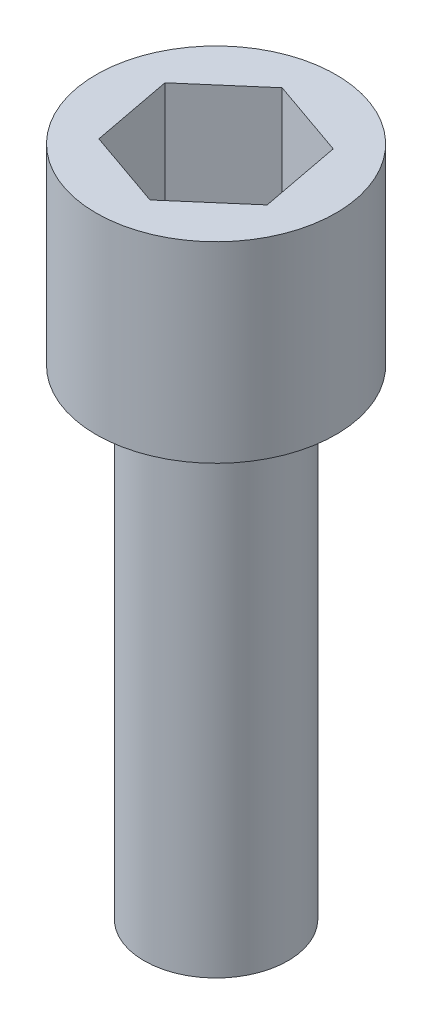
ISO-10303-21;
HEADER;
FILE_DESCRIPTION(('STEP AP214'),'2;1');
FILE_NAME('part.step','',(''),(''),'','','');
FILE_SCHEMA(('AUTOMOTIVE_DESIGN { 1 0 10303 214 1 1 1 1 }'));
ENDSEC;
DATA;
#1=APPLICATION_CONTEXT('core data for automotive mechanical design processes');
#2=APPLICATION_PROTOCOL_DEFINITION('international standard','automotive_design',2000,#1);
#3=PRODUCT_CONTEXT('',#1,'mechanical');
#4=PRODUCT('Part','Part','',(#3));
#5=PRODUCT_RELATED_PRODUCT_CATEGORY('part','',(#4));
#6=PRODUCT_DEFINITION_FORMATION('','',#4);
#7=PRODUCT_DEFINITION_CONTEXT('part definition',#1,'design');
#8=PRODUCT_DEFINITION('design','',#6,#7);
#9=PRODUCT_DEFINITION_SHAPE('','',#8);
#10=(LENGTH_UNIT() NAMED_UNIT(*) SI_UNIT(.MILLI.,.METRE.));
#11=(NAMED_UNIT(*) PLANE_ANGLE_UNIT() SI_UNIT($,.RADIAN.));
#12=(NAMED_UNIT(*) SI_UNIT($,.STERADIAN.) SOLID_ANGLE_UNIT());
#13=UNCERTAINTY_MEASURE_WITH_UNIT(LENGTH_MEASURE(1.E-05),#10,'distance_accuracy_value','');
#14=(GEOMETRIC_REPRESENTATION_CONTEXT(3) GLOBAL_UNCERTAINTY_ASSIGNED_CONTEXT((#13)) GLOBAL_UNIT_ASSIGNED_CONTEXT((#10,
#11,#12)) REPRESENTATION_CONTEXT('',''));
#15=CARTESIAN_POINT('',(0.,0.,0.));
#16=DIRECTION('',(0.,0.,1.));
#17=DIRECTION('',(1.,0.,0.));
#18=AXIS2_PLACEMENT_3D('',#15,#16,#17);
#19=CARTESIAN_POINT('',(0.,20.,0.));
#20=DIRECTION('',(0.,-1.,0.));
#21=DIRECTION('',(0.,0.,-1.));
#22=AXIS2_PLACEMENT_3D('',#19,#20,#21);
#23=CYLINDRICAL_SURFACE('',#22,3.);
#24=CARTESIAN_POINT('',(0.,20.,0.));
#25=DIRECTION('',(0.,1.,0.));
#26=DIRECTION('',(0.,0.,1.));
#27=AXIS2_PLACEMENT_3D('',#24,#25,#26);
#28=CIRCLE('',#27,3.);
#29=CARTESIAN_POINT('',(0.,20.,3.));
#30=VERTEX_POINT('',#29);
#31=EDGE_CURVE('E11',#30,#30,#28,.T.);
#32=ORIENTED_EDGE('',*,*,#31,.F.);
#33=EDGE_LOOP('',(#32));
#34=FACE_BOUND('',#33,.T.);
#35=CARTESIAN_POINT('',(0.,0.,0.));
#36=DIRECTION('',(0.,1.,0.));
#37=DIRECTION('',(0.,0.,1.));
#38=AXIS2_PLACEMENT_3D('',#35,#36,#37);
#39=CIRCLE('',#38,3.);
#40=CARTESIAN_POINT('',(0.,0.,3.));
#41=VERTEX_POINT('',#40);
#42=EDGE_CURVE('E36',#41,#41,#39,.T.);
#43=ORIENTED_EDGE('',*,*,#42,.T.);
#44=EDGE_LOOP('',(#43));
#45=FACE_BOUND('',#44,.T.);
#46=ADVANCED_FACE('F33',(#34,#45),#23,.T.);
#47=CARTESIAN_POINT('',(0.,0.,0.));
#48=DIRECTION('',(0.,1.,0.));
#49=DIRECTION('',(0.,0.,1.));
#50=AXIS2_PLACEMENT_3D('',#47,#48,#49);
#51=PLANE('',#50);
#52=ORIENTED_EDGE('',*,*,#42,.F.);
#53=EDGE_LOOP('',(#52));
#54=FACE_BOUND('',#53,.T.);
#55=ADVANCED_FACE('F151',(#54),#51,.F.);
#56=CARTESIAN_POINT('',(0.,20.,0.));
#57=DIRECTION('',(0.,1.,0.));
#58=DIRECTION('',(0.,0.,1.));
#59=AXIS2_PLACEMENT_3D('',#56,#57,#58);
#60=PLANE('',#59);
#61=CARTESIAN_POINT('',(0.,20.,0.));
#62=DIRECTION('',(0.,1.,0.));
#63=DIRECTION('',(0.,0.,1.));
#64=AXIS2_PLACEMENT_3D('',#61,#62,#63);
#65=CIRCLE('',#64,5.);
#66=CARTESIAN_POINT('',(0.,20.,5.));
#67=VERTEX_POINT('',#66);
#68=EDGE_CURVE('E134',#67,#67,#65,.T.);
#69=ORIENTED_EDGE('',*,*,#68,.F.);
#70=EDGE_LOOP('',(#69));
#71=FACE_BOUND('',#70,.T.);
#72=ORIENTED_EDGE('',*,*,#31,.T.);
#73=EDGE_LOOP('',(#72));
#74=FACE_BOUND('',#73,.T.);
#75=ADVANCED_FACE('F148',(#71,#74),#60,.F.);
#76=CARTESIAN_POINT('',(0.,28.,0.));
#77=DIRECTION('',(0.,-1.,0.));
#78=DIRECTION('',(0.,0.,-1.));
#79=AXIS2_PLACEMENT_3D('',#76,#77,#78);
#80=CYLINDRICAL_SURFACE('',#79,5.);
#81=CARTESIAN_POINT('',(0.,28.,0.));
#82=DIRECTION('',(0.,1.,0.));
#83=DIRECTION('',(0.,0.,1.));
#84=AXIS2_PLACEMENT_3D('',#81,#82,#83);
#85=CIRCLE('',#84,5.);
#86=CARTESIAN_POINT('',(0.,28.,5.));
#87=VERTEX_POINT('',#86);
#88=EDGE_CURVE('E140',#87,#87,#85,.T.);
#89=ORIENTED_EDGE('',*,*,#88,.F.);
#90=EDGE_LOOP('',(#89));
#91=FACE_BOUND('',#90,.T.);
#92=ORIENTED_EDGE('',*,*,#68,.T.);
#93=EDGE_LOOP('',(#92));
#94=FACE_BOUND('',#93,.T.);
#95=ADVANCED_FACE('F146',(#91,#94),#80,.T.);
#96=CARTESIAN_POINT('',(0.,28.,0.));
#97=DIRECTION('',(0.,1.,0.));
#98=DIRECTION('',(0.,0.,1.));
#99=AXIS2_PLACEMENT_3D('',#96,#97,#98);
#100=PLANE('',#99);
#101=DIRECTION('',(0.944266096339941,0.,0.329183139457246));
#102=VECTOR('',#101,1.);
#103=CARTESIAN_POINT('',(-2.62306627309725,28.,2.26263636648484));
#104=LINE('',#103,#102);
#105=CARTESIAN_POINT('',(-2.62306627309725,28.,2.26263636648484));
#106=VERTEX_POINT('',#105);
#107=CARTESIAN_POINT('',(0.647967436353767,28.,3.40296021155481));
#108=VERTEX_POINT('',#107);
#109=EDGE_CURVE('E47',#106,#108,#104,.T.);
#110=ORIENTED_EDGE('',*,*,#109,.F.);
#111=DIRECTION('',(0.18705208690248,0.,0.982349997091376));
#112=VECTOR('',#111,1.);
#113=CARTESIAN_POINT('',(-3.27103370945101,28.,-1.14032384506996));
#114=LINE('',#113,#112);
#115=CARTESIAN_POINT('',(-3.27103370945101,28.,-1.14032384506996));
#116=VERTEX_POINT('',#115);
#117=EDGE_CURVE('E130',#116,#106,#114,.T.);
#118=ORIENTED_EDGE('',*,*,#117,.F.);
#119=DIRECTION('',(-0.757214009437461,0.,0.65316685763413));
#120=VECTOR('',#119,1.);
#121=CARTESIAN_POINT('',(-0.647967436353768,28.,-3.40296021155481));
#122=LINE('',#121,#120);
#123=CARTESIAN_POINT('',(-0.647967436353768,28.,-3.40296021155481));
#124=VERTEX_POINT('',#123);
#125=EDGE_CURVE('E128',#124,#116,#122,.T.);
#126=ORIENTED_EDGE('',*,*,#125,.F.);
#127=DIRECTION('',(-0.944266096339941,0.,-0.329183139457246));
#128=VECTOR('',#127,1.);
#129=CARTESIAN_POINT('',(2.62306627309724,28.,-2.26263636648484));
#130=LINE('',#129,#128);
#131=CARTESIAN_POINT('',(2.62306627309724,28.,-2.26263636648484));
#132=VERTEX_POINT('',#131);
#133=EDGE_CURVE('E95',#132,#124,#130,.T.);
#134=ORIENTED_EDGE('',*,*,#133,.F.);
#135=DIRECTION('',(-0.18705208690248,0.,-0.982349997091376));
#136=VECTOR('',#135,1.);
#137=CARTESIAN_POINT('',(3.27103370945101,28.,1.14032384506996));
#138=LINE('',#137,#136);
#139=CARTESIAN_POINT('',(3.27103370945101,28.,1.14032384506996));
#140=VERTEX_POINT('',#139);
#141=EDGE_CURVE('E124',#140,#132,#138,.T.);
#142=ORIENTED_EDGE('',*,*,#141,.F.);
#143=DIRECTION('',(0.757214009437461,0.,-0.65316685763413));
#144=VECTOR('',#143,1.);
#145=CARTESIAN_POINT('',(0.647967436353767,28.,3.40296021155481));
#146=LINE('',#145,#144);
#147=EDGE_CURVE('E121',#108,#140,#146,.T.);
#148=ORIENTED_EDGE('',*,*,#147,.F.);
#149=EDGE_LOOP('',(#110,#118,#126,#134,#142,#148));
#150=FACE_BOUND('',#149,.T.);
#151=ORIENTED_EDGE('',*,*,#88,.T.);
#152=EDGE_LOOP('',(#151));
#153=FACE_BOUND('',#152,.T.);
#154=ADVANCED_FACE('F165',(#150,#153),#100,.T.);
#155=CARTESIAN_POINT('',(-2.62306627309725,23.,2.26263636648484));
#156=DIRECTION('',(-0.329183139457246,0.,0.944266096339941));
#157=DIRECTION('',(0.944266096339941,0.,0.329183139457246));
#158=AXIS2_PLACEMENT_3D('',#155,#156,#157);
#159=PLANE('',#158);
#160=ORIENTED_EDGE('',*,*,#109,.T.);
#161=DIRECTION('',(0.,1.,0.));
#162=VECTOR('',#161,1.);
#163=CARTESIAN_POINT('',(0.647967436353767,23.,3.40296021155481));
#164=LINE('',#163,#162);
#165=CARTESIAN_POINT('',(0.647967436353767,23.,3.40296021155481));
#166=VERTEX_POINT('',#165);
#167=EDGE_CURVE('E77',#166,#108,#164,.T.);
#168=ORIENTED_EDGE('',*,*,#167,.F.);
#169=DIRECTION('',(0.944266096339941,0.,0.329183139457246));
#170=VECTOR('',#169,1.);
#171=CARTESIAN_POINT('',(-2.62306627309725,23.,2.26263636648484));
#172=LINE('',#171,#170);
#173=CARTESIAN_POINT('',(-2.62306627309725,23.,2.26263636648484));
#174=VERTEX_POINT('',#173);
#175=EDGE_CURVE('E132',#174,#166,#172,.T.);
#176=ORIENTED_EDGE('',*,*,#175,.F.);
#177=DIRECTION('',(0.,1.,0.));
#178=VECTOR('',#177,1.);
#179=CARTESIAN_POINT('',(-2.62306627309725,23.,2.26263636648484));
#180=LINE('',#179,#178);
#181=EDGE_CURVE('E55',#174,#106,#180,.T.);
#182=ORIENTED_EDGE('',*,*,#181,.T.);
#183=EDGE_LOOP('',(#160,#168,#176,#182));
#184=FACE_BOUND('',#183,.T.);
#185=ADVANCED_FACE('F170',(#184),#159,.F.);
#186=CARTESIAN_POINT('',(-3.27103370945101,23.,-1.14032384506996));
#187=DIRECTION('',(-0.982349997091376,0.,0.18705208690248));
#188=DIRECTION('',(0.18705208690248,0.,0.982349997091377));
#189=AXIS2_PLACEMENT_3D('',#186,#187,#188);
#190=PLANE('',#189);
#191=ORIENTED_EDGE('',*,*,#117,.T.);
#192=ORIENTED_EDGE('',*,*,#181,.F.);
#193=DIRECTION('',(0.18705208690248,0.,0.982349997091376));
#194=VECTOR('',#193,1.);
#195=CARTESIAN_POINT('',(-3.27103370945101,23.,-1.14032384506996));
#196=LINE('',#195,#194);
#197=CARTESIAN_POINT('',(-3.27103370945101,23.,-1.14032384506996));
#198=VERTEX_POINT('',#197);
#199=EDGE_CURVE('E107',#198,#174,#196,.T.);
#200=ORIENTED_EDGE('',*,*,#199,.F.);
#201=DIRECTION('',(0.,1.,0.));
#202=VECTOR('',#201,1.);
#203=CARTESIAN_POINT('',(-3.27103370945101,23.,-1.14032384506996));
#204=LINE('',#203,#202);
#205=EDGE_CURVE('E99',#198,#116,#204,.T.);
#206=ORIENTED_EDGE('',*,*,#205,.T.);
#207=EDGE_LOOP('',(#191,#192,#200,#206));
#208=FACE_BOUND('',#207,.T.);
#209=ADVANCED_FACE('F174',(#208),#190,.F.);
#210=CARTESIAN_POINT('',(-0.647967436353768,23.,-3.40296021155481));
#211=DIRECTION('',(-0.65316685763413,0.,-0.757214009437461));
#212=DIRECTION('',(-0.757214009437462,0.,0.65316685763413));
#213=AXIS2_PLACEMENT_3D('',#210,#211,#212);
#214=PLANE('',#213);
#215=ORIENTED_EDGE('',*,*,#125,.T.);
#216=ORIENTED_EDGE('',*,*,#205,.F.);
#217=DIRECTION('',(-0.757214009437461,0.,0.65316685763413));
#218=VECTOR('',#217,1.);
#219=CARTESIAN_POINT('',(-0.647967436353768,23.,-3.40296021155481));
#220=LINE('',#219,#218);
#221=CARTESIAN_POINT('',(-0.647967436353768,23.,-3.40296021155481));
#222=VERTEX_POINT('',#221);
#223=EDGE_CURVE('E103',#222,#198,#220,.T.);
#224=ORIENTED_EDGE('',*,*,#223,.F.);
#225=DIRECTION('',(0.,1.,0.));
#226=VECTOR('',#225,1.);
#227=CARTESIAN_POINT('',(-0.647967436353768,23.,-3.40296021155481));
#228=LINE('',#227,#226);
#229=EDGE_CURVE('E88',#222,#124,#228,.T.);
#230=ORIENTED_EDGE('',*,*,#229,.T.);
#231=EDGE_LOOP('',(#215,#216,#224,#230));
#232=FACE_BOUND('',#231,.T.);
#233=ADVANCED_FACE('F104',(#232),#214,.F.);
#234=CARTESIAN_POINT('',(2.62306627309724,23.,-2.26263636648484));
#235=DIRECTION('',(0.329183139457246,0.,-0.944266096339941));
#236=DIRECTION('',(-0.944266096339941,0.,-0.329183139457246));
#237=AXIS2_PLACEMENT_3D('',#234,#235,#236);
#238=PLANE('',#237);
#239=ORIENTED_EDGE('',*,*,#133,.T.);
#240=ORIENTED_EDGE('',*,*,#229,.F.);
#241=DIRECTION('',(-0.944266096339941,0.,-0.329183139457246));
#242=VECTOR('',#241,1.);
#243=CARTESIAN_POINT('',(2.62306627309724,23.,-2.26263636648484));
#244=LINE('',#243,#242);
#245=CARTESIAN_POINT('',(2.62306627309724,23.,-2.26263636648484));
#246=VERTEX_POINT('',#245);
#247=EDGE_CURVE('E92',#246,#222,#244,.T.);
#248=ORIENTED_EDGE('',*,*,#247,.F.);
#249=DIRECTION('',(0.,1.,0.));
#250=VECTOR('',#249,1.);
#251=CARTESIAN_POINT('',(2.62306627309724,23.,-2.26263636648484));
#252=LINE('',#251,#250);
#253=EDGE_CURVE('E100',#246,#132,#252,.T.);
#254=ORIENTED_EDGE('',*,*,#253,.T.);
#255=EDGE_LOOP('',(#239,#240,#248,#254));
#256=FACE_BOUND('',#255,.T.);
#257=ADVANCED_FACE('F90',(#256),#238,.F.);
#258=CARTESIAN_POINT('',(3.27103370945101,23.,1.14032384506996));
#259=DIRECTION('',(0.982349997091376,0.,-0.18705208690248));
#260=DIRECTION('',(-0.18705208690248,0.,-0.982349997091376));
#261=AXIS2_PLACEMENT_3D('',#258,#259,#260);
#262=PLANE('',#261);
#263=ORIENTED_EDGE('',*,*,#141,.T.);
#264=ORIENTED_EDGE('',*,*,#253,.F.);
#265=DIRECTION('',(-0.18705208690248,0.,-0.982349997091376));
#266=VECTOR('',#265,1.);
#267=CARTESIAN_POINT('',(3.27103370945101,23.,1.14032384506996));
#268=LINE('',#267,#266);
#269=CARTESIAN_POINT('',(3.27103370945101,23.,1.14032384506996));
#270=VERTEX_POINT('',#269);
#271=EDGE_CURVE('E113',#270,#246,#268,.T.);
#272=ORIENTED_EDGE('',*,*,#271,.F.);
#273=DIRECTION('',(0.,1.,0.));
#274=VECTOR('',#273,1.);
#275=CARTESIAN_POINT('',(3.27103370945101,23.,1.14032384506996));
#276=LINE('',#275,#274);
#277=EDGE_CURVE('E137',#270,#140,#276,.T.);
#278=ORIENTED_EDGE('',*,*,#277,.T.);
#279=EDGE_LOOP('',(#263,#264,#272,#278));
#280=FACE_BOUND('',#279,.T.);
#281=ADVANCED_FACE('F178',(#280),#262,.F.);
#282=CARTESIAN_POINT('',(0.647967436353767,23.,3.40296021155481));
#283=DIRECTION('',(0.65316685763413,0.,0.757214009437461));
#284=DIRECTION('',(0.757214009437462,0.,-0.65316685763413));
#285=AXIS2_PLACEMENT_3D('',#282,#283,#284);
#286=PLANE('',#285);
#287=ORIENTED_EDGE('',*,*,#147,.T.);
#288=ORIENTED_EDGE('',*,*,#277,.F.);
#289=DIRECTION('',(0.757214009437461,0.,-0.65316685763413));
#290=VECTOR('',#289,1.);
#291=CARTESIAN_POINT('',(0.647967436353767,23.,3.40296021155481));
#292=LINE('',#291,#290);
#293=EDGE_CURVE('E115',#166,#270,#292,.T.);
#294=ORIENTED_EDGE('',*,*,#293,.F.);
#295=ORIENTED_EDGE('',*,*,#167,.T.);
#296=EDGE_LOOP('',(#287,#288,#294,#295));
#297=FACE_BOUND('',#296,.T.);
#298=ADVANCED_FACE('F175',(#297),#286,.F.);
#299=CARTESIAN_POINT('',(0.,23.,0.));
#300=DIRECTION('',(0.,1.,0.));
#301=DIRECTION('',(0.,0.,1.));
#302=AXIS2_PLACEMENT_3D('',#299,#300,#301);
#303=PLANE('',#302);
#304=ORIENTED_EDGE('',*,*,#175,.T.);
#305=ORIENTED_EDGE('',*,*,#293,.T.);
#306=ORIENTED_EDGE('',*,*,#271,.T.);
#307=ORIENTED_EDGE('',*,*,#247,.T.);
#308=ORIENTED_EDGE('',*,*,#223,.T.);
#309=ORIENTED_EDGE('',*,*,#199,.T.);
#310=EDGE_LOOP('',(#304,#305,#306,#307,#308,#309));
#311=FACE_BOUND('',#310,.T.);
#312=ADVANCED_FACE('F110',(#311),#303,.T.);
#313=CLOSED_SHELL('',(#46,#55,#75,#95,#154,#185,#209,#233,#257,#281,#298,#312));
#314=MANIFOLD_SOLID_BREP('B2',#313);
#315=ADVANCED_BREP_SHAPE_REPRESENTATION('',(#18,#314),#14);
#316=SHAPE_DEFINITION_REPRESENTATION(#9,#315);
ENDSEC;
END-ISO-10303-21;
